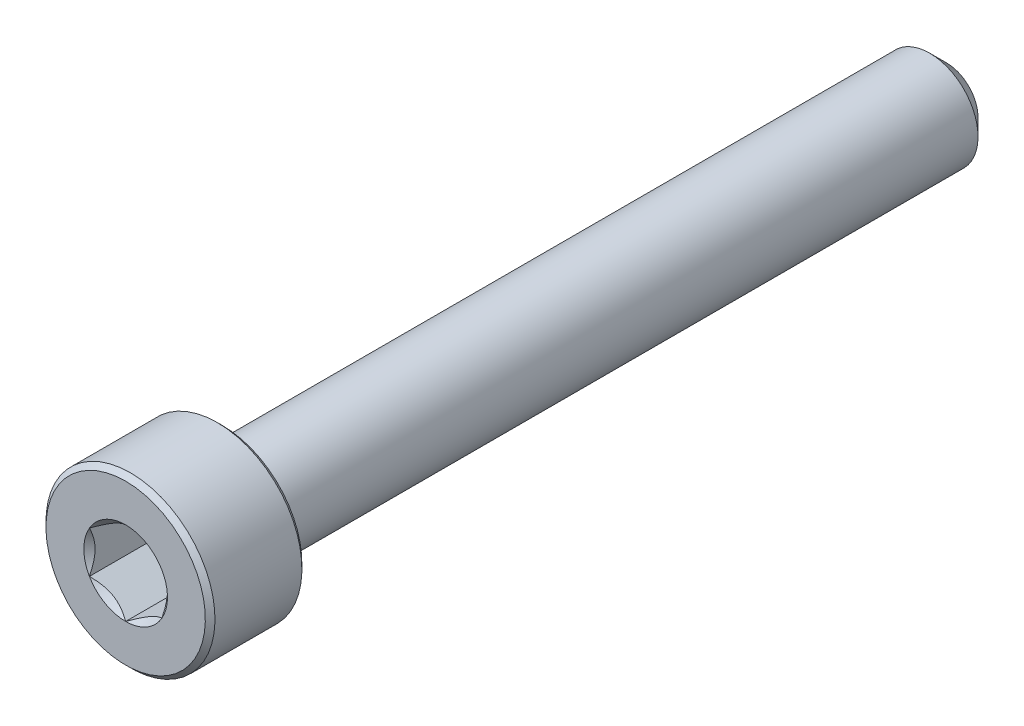
ISO-10303-21;
HEADER;
FILE_DESCRIPTION(('STEP AP214'),'2;1');
FILE_NAME('part.step','',(''),(''),'','','');
FILE_SCHEMA(('AUTOMOTIVE_DESIGN { 1 0 10303 214 1 1 1 1 }'));
ENDSEC;
DATA;
#1=APPLICATION_CONTEXT('core data for automotive mechanical design processes');
#2=APPLICATION_PROTOCOL_DEFINITION('international standard','automotive_design',2000,#1);
#3=PRODUCT_CONTEXT('',#1,'mechanical');
#4=PRODUCT('Part','Part','',(#3));
#5=PRODUCT_RELATED_PRODUCT_CATEGORY('part','',(#4));
#6=PRODUCT_DEFINITION_FORMATION('','',#4);
#7=PRODUCT_DEFINITION_CONTEXT('part definition',#1,'design');
#8=PRODUCT_DEFINITION('design','',#6,#7);
#9=PRODUCT_DEFINITION_SHAPE('','',#8);
#10=(LENGTH_UNIT() NAMED_UNIT(*) SI_UNIT(.MILLI.,.METRE.));
#11=(NAMED_UNIT(*) PLANE_ANGLE_UNIT() SI_UNIT($,.RADIAN.));
#12=(NAMED_UNIT(*) SI_UNIT($,.STERADIAN.) SOLID_ANGLE_UNIT());
#13=UNCERTAINTY_MEASURE_WITH_UNIT(LENGTH_MEASURE(1.E-05),#10,'distance_accuracy_value','');
#14=(GEOMETRIC_REPRESENTATION_CONTEXT(3) GLOBAL_UNCERTAINTY_ASSIGNED_CONTEXT((#13)) GLOBAL_UNIT_ASSIGNED_CONTEXT((#10,
#11,#12)) REPRESENTATION_CONTEXT('',''));
#15=CARTESIAN_POINT('',(0.,0.,0.));
#16=DIRECTION('',(0.,0.,1.));
#17=DIRECTION('',(1.,0.,0.));
#18=AXIS2_PLACEMENT_3D('',#15,#16,#17);
#19=CARTESIAN_POINT('',(0.,0.,17.));
#20=DIRECTION('',(0.,0.,1.));
#21=DIRECTION('',(0.,-1.,0.));
#22=AXIS2_PLACEMENT_3D('',#19,#20,#21);
#23=PLANE('',#22);
#24=CARTESIAN_POINT('',(0.,0.,17.));
#25=DIRECTION('',(0.,0.,1.));
#26=DIRECTION('',(1.,0.,0.));
#27=AXIS2_PLACEMENT_3D('',#24,#25,#26);
#28=CIRCLE('',#27,1.73205080756888);
#29=CARTESIAN_POINT('',(0.,-1.73205080756888,17.));
#30=VERTEX_POINT('',#29);
#31=CARTESIAN_POINT('',(1.5,-0.866025403784438,17.));
#32=VERTEX_POINT('',#31);
#33=EDGE_CURVE('E106',#30,#32,#28,.T.);
#34=ORIENTED_EDGE('',*,*,#33,.F.);
#35=CARTESIAN_POINT('',(-1.5,-0.866025403784439,17.));
#36=VERTEX_POINT('',#35);
#37=EDGE_CURVE('E300',#36,#30,#28,.T.);
#38=ORIENTED_EDGE('',*,*,#37,.F.);
#39=CARTESIAN_POINT('',(-1.5,0.86602540378444,17.));
#40=VERTEX_POINT('',#39);
#41=EDGE_CURVE('E147',#40,#36,#28,.T.);
#42=ORIENTED_EDGE('',*,*,#41,.F.);
#43=CARTESIAN_POINT('',(0.,1.73205080756888,17.));
#44=VERTEX_POINT('',#43);
#45=EDGE_CURVE('E140',#44,#40,#28,.T.);
#46=ORIENTED_EDGE('',*,*,#45,.F.);
#47=CARTESIAN_POINT('',(1.5,0.86602540378444,17.));
#48=VERTEX_POINT('',#47);
#49=EDGE_CURVE('E108',#48,#44,#28,.T.);
#50=ORIENTED_EDGE('',*,*,#49,.F.);
#51=EDGE_CURVE('E99',#32,#48,#28,.T.);
#52=ORIENTED_EDGE('',*,*,#51,.F.);
#53=EDGE_LOOP('',(#34,#38,#42,#46,#50,#52));
#54=FACE_BOUND('',#53,.T.);
#55=CARTESIAN_POINT('',(0.,0.,17.));
#56=DIRECTION('',(0.,0.,-1.));
#57=DIRECTION('',(0.,1.,0.));
#58=AXIS2_PLACEMENT_3D('',#55,#56,#57);
#59=CIRCLE('',#58,3.3);
#60=CARTESIAN_POINT('',(0.,3.3,17.));
#61=VERTEX_POINT('',#60);
#62=EDGE_CURVE('E55',#61,#61,#59,.T.);
#63=ORIENTED_EDGE('',*,*,#62,.F.);
#64=EDGE_LOOP('',(#63));
#65=FACE_BOUND('',#64,.T.);
#66=ADVANCED_FACE('F41',(#54,#65),#23,.T.);
#67=CARTESIAN_POINT('',(0.,0.,16.8));
#68=DIRECTION('',(0.,0.,-1.));
#69=DIRECTION('',(0.,1.,0.));
#70=AXIS2_PLACEMENT_3D('',#67,#68,#69);
#71=CONICAL_SURFACE('',#70,3.5,0.785398163397452);
#72=ORIENTED_EDGE('',*,*,#62,.T.);
#73=EDGE_LOOP('',(#72));
#74=FACE_BOUND('',#73,.T.);
#75=CARTESIAN_POINT('',(0.,0.,16.8));
#76=DIRECTION('',(0.,0.,-1.));
#77=DIRECTION('',(0.,1.,0.));
#78=AXIS2_PLACEMENT_3D('',#75,#76,#77);
#79=CIRCLE('',#78,3.5);
#80=CARTESIAN_POINT('',(0.,3.5,16.8));
#81=VERTEX_POINT('',#80);
#82=EDGE_CURVE('E233',#81,#81,#79,.T.);
#83=ORIENTED_EDGE('',*,*,#82,.F.);
#84=EDGE_LOOP('',(#83));
#85=FACE_BOUND('',#84,.T.);
#86=ADVANCED_FACE('F221',(#74,#85),#71,.T.);
#87=CARTESIAN_POINT('',(0.,0.,-17.));
#88=DIRECTION('',(0.,0.,-1.));
#89=DIRECTION('',(0.,1.,0.));
#90=AXIS2_PLACEMENT_3D('',#87,#88,#89);
#91=CYLINDRICAL_SURFACE('',#90,3.5);
#92=ORIENTED_EDGE('',*,*,#82,.T.);
#93=EDGE_LOOP('',(#92));
#94=FACE_BOUND('',#93,.T.);
#95=CARTESIAN_POINT('',(0.,0.,13.2));
#96=DIRECTION('',(0.,0.,-1.));
#97=DIRECTION('',(0.,1.,0.));
#98=AXIS2_PLACEMENT_3D('',#95,#96,#97);
#99=CIRCLE('',#98,3.5);
#100=CARTESIAN_POINT('',(0.,3.5,13.2));
#101=VERTEX_POINT('',#100);
#102=EDGE_CURVE('E235',#101,#101,#99,.T.);
#103=ORIENTED_EDGE('',*,*,#102,.F.);
#104=EDGE_LOOP('',(#103));
#105=FACE_BOUND('',#104,.T.);
#106=ADVANCED_FACE('F218',(#94,#105),#91,.T.);
#107=CARTESIAN_POINT('',(0.,0.,13.));
#108=DIRECTION('',(0.,0.,1.));
#109=DIRECTION('',(0.,-1.,0.));
#110=AXIS2_PLACEMENT_3D('',#107,#108,#109);
#111=CONICAL_SURFACE('',#110,3.3,0.785398163397443);
#112=ORIENTED_EDGE('',*,*,#102,.T.);
#113=EDGE_LOOP('',(#112));
#114=FACE_BOUND('',#113,.T.);
#115=CARTESIAN_POINT('',(0.,0.,13.));
#116=DIRECTION('',(0.,0.,-1.));
#117=DIRECTION('',(0.,1.,0.));
#118=AXIS2_PLACEMENT_3D('',#115,#116,#117);
#119=CIRCLE('',#118,3.3);
#120=CARTESIAN_POINT('',(0.,3.3,13.));
#121=VERTEX_POINT('',#120);
#122=EDGE_CURVE('E240',#121,#121,#119,.T.);
#123=ORIENTED_EDGE('',*,*,#122,.F.);
#124=EDGE_LOOP('',(#123));
#125=FACE_BOUND('',#124,.T.);
#126=ADVANCED_FACE('F214',(#114,#125),#111,.T.);
#127=CARTESIAN_POINT('',(0.,3.3,13.));
#128=DIRECTION('',(0.,0.,-1.));
#129=DIRECTION('',(0.,1.,0.));
#130=AXIS2_PLACEMENT_3D('',#127,#128,#129);
#131=PLANE('',#130);
#132=ORIENTED_EDGE('',*,*,#122,.T.);
#133=EDGE_LOOP('',(#132));
#134=FACE_BOUND('',#133,.T.);
#135=CARTESIAN_POINT('',(0.,0.,13.));
#136=DIRECTION('',(0.,0.,-1.));
#137=DIRECTION('',(0.,1.,0.));
#138=AXIS2_PLACEMENT_3D('',#135,#136,#137);
#139=CIRCLE('',#138,2.);
#140=CARTESIAN_POINT('',(0.,2.,13.));
#141=VERTEX_POINT('',#140);
#142=EDGE_CURVE('E246',#141,#141,#139,.T.);
#143=ORIENTED_EDGE('',*,*,#142,.F.);
#144=EDGE_LOOP('',(#143));
#145=FACE_BOUND('',#144,.T.);
#146=ADVANCED_FACE('F210',(#134,#145),#131,.T.);
#147=CARTESIAN_POINT('',(0.,0.,-17.));
#148=DIRECTION('',(0.,0.,-1.));
#149=DIRECTION('',(0.,1.,0.));
#150=AXIS2_PLACEMENT_3D('',#147,#148,#149);
#151=CYLINDRICAL_SURFACE('',#150,2.);
#152=ORIENTED_EDGE('',*,*,#142,.T.);
#153=EDGE_LOOP('',(#152));
#154=FACE_BOUND('',#153,.T.);
#155=CARTESIAN_POINT('',(0.,0.,-16.3));
#156=DIRECTION('',(0.,0.,-1.));
#157=DIRECTION('',(0.,1.,0.));
#158=AXIS2_PLACEMENT_3D('',#155,#156,#157);
#159=CIRCLE('',#158,2.);
#160=CARTESIAN_POINT('',(0.,2.,-16.3));
#161=VERTEX_POINT('',#160);
#162=EDGE_CURVE('E250',#161,#161,#159,.T.);
#163=ORIENTED_EDGE('',*,*,#162,.F.);
#164=EDGE_LOOP('',(#163));
#165=FACE_BOUND('',#164,.T.);
#166=ADVANCED_FACE('F206',(#154,#165),#151,.T.);
#167=CARTESIAN_POINT('',(0.,0.,-17.));
#168=DIRECTION('',(0.,0.,1.));
#169=DIRECTION('',(0.,-1.,0.));
#170=AXIS2_PLACEMENT_3D('',#167,#168,#169);
#171=CONICAL_SURFACE('',#170,1.3,0.785398163397442);
#172=ORIENTED_EDGE('',*,*,#162,.T.);
#173=EDGE_LOOP('',(#172));
#174=FACE_BOUND('',#173,.T.);
#175=CARTESIAN_POINT('',(0.,0.,-17.));
#176=DIRECTION('',(0.,0.,-1.));
#177=DIRECTION('',(0.,1.,0.));
#178=AXIS2_PLACEMENT_3D('',#175,#176,#177);
#179=CIRCLE('',#178,1.3);
#180=CARTESIAN_POINT('',(0.,1.3,-17.));
#181=VERTEX_POINT('',#180);
#182=EDGE_CURVE('E254',#181,#181,#179,.T.);
#183=ORIENTED_EDGE('',*,*,#182,.F.);
#184=EDGE_LOOP('',(#183));
#185=FACE_BOUND('',#184,.T.);
#186=ADVANCED_FACE('F202',(#174,#185),#171,.T.);
#187=CARTESIAN_POINT('',(0.,1.3,-17.));
#188=DIRECTION('',(0.,0.,-1.));
#189=DIRECTION('',(0.,1.,0.));
#190=AXIS2_PLACEMENT_3D('',#187,#188,#189);
#191=PLANE('',#190);
#192=ORIENTED_EDGE('',*,*,#182,.T.);
#193=EDGE_LOOP('',(#192));
#194=FACE_BOUND('',#193,.T.);
#195=ADVANCED_FACE('F199',(#194),#191,.T.);
#196=CARTESIAN_POINT('',(0.,0.,17.));
#197=DIRECTION('',(0.,0.,1.));
#198=DIRECTION('',(1.,0.,0.));
#199=AXIS2_PLACEMENT_3D('',#196,#197,#198);
#200=CONICAL_SURFACE('',#199,1.73205080756888,0.78539816339745);
#201=ORIENTED_EDGE('',*,*,#33,.T.);
#202=CARTESIAN_POINT('',(-0.000199999999999638,-1.73216627762272,17.0001154816001));
#203=CARTESIAN_POINT('',(0.0513677907370756,-1.70239359975915,16.9703654760673));
#204=CARTESIAN_POINT('',(0.103797917665201,-1.67212305186355,16.9423624839103));
#205=CARTESIAN_POINT('',(0.210709034055597,-1.61039789003619,16.8910892304401));
#206=CARTESIAN_POINT('',(0.265200195814662,-1.57893740312614,16.8678475050444));
#207=CARTESIAN_POINT('',(0.37507908135725,-1.51549879897987,16.8280337289922));
#208=CARTESIAN_POINT('',(0.430438809095201,-1.4835368452681,16.8113615856709));
#209=CARTESIAN_POINT('',(0.542377257477152,-1.41890915196211,16.7856744568181));
#210=CARTESIAN_POINT('',(0.59895255655301,-1.38624538781118,16.7766402904789));
#211=CARTESIAN_POINT('',(0.696455389516442,-1.32995210095299,16.7684890812269));
#212=CARTESIAN_POINT('',(0.737256908280468,-1.30639533311124,16.7672822529892));
#213=CARTESIAN_POINT('',(0.81878796961586,-1.25932335290193,16.7693140571623));
#214=CARTESIAN_POINT('',(0.859517494314631,-1.23580815085313,16.7725536707483));
#215=CARTESIAN_POINT('',(0.940584402163417,-1.18900414978427,16.783291985982));
#216=CARTESIAN_POINT('',(0.980921384598289,-1.16571558211719,16.7907946530187));
#217=CARTESIAN_POINT('',(1.06091833691403,-1.11952932016335,16.8096516119283));
#218=CARTESIAN_POINT('',(1.10057800851621,-1.09663179808786,16.8210075570186));
#219=CARTESIAN_POINT('',(1.20216313477449,-1.03798159809698,16.8547216475927));
#220=CARTESIAN_POINT('',(1.26345855370969,-1.00259267147465,16.8796218490934));
#221=CARTESIAN_POINT('',(1.35358562846331,-0.950557780604374,16.9216566532716));
#222=CARTESIAN_POINT('',(1.38328513990772,-0.933410759677147,16.9364251535591));
#223=CARTESIAN_POINT('',(1.44213790138375,-0.899432101996406,16.9673105659402));
#224=CARTESIAN_POINT('',(1.47129140422064,-0.88260031928571,16.9834268341217));
#225=CARTESIAN_POINT('',(1.5002,-0.865909933730601,17.0001154816001));
#226=B_SPLINE_CURVE_WITH_KNOTS('',3,(#202,#203,#204,#205,#206,#207,#208,#209,#210,#211,#212,
#213,#214,#215,#216,#217,#218,#219,#220,#221,#222,#223,#224,#225),.UNSPECIFIED.,.F.,.F.,(4,2,2,
2,2,2,2,2,2,2,2,4),(0.,0.199829143693305,0.40082298738239,0.598623720538183,0.795926240188891,
0.937113067959883,1.07833105577193,1.21968061668222,1.36109089931055,1.58570969637566,
1.69770705470964,1.80965120737194),.UNSPECIFIED.);
#227=EDGE_CURVE('E12',#30,#32,#226,.T.);
#228=ORIENTED_EDGE('',*,*,#227,.F.);
#229=EDGE_LOOP('',(#201,#228));
#230=FACE_BOUND('',#229,.T.);
#231=ADVANCED_FACE('F165',(#230),#200,.F.);
#232=ORIENTED_EDGE('',*,*,#37,.T.);
#233=CARTESIAN_POINT('',(-1.5002,-0.865909933730601,17.0001154816001));
#234=CARTESIAN_POINT('',(-1.44863220926292,-0.895682611594166,16.9703654760673));
#235=CARTESIAN_POINT('',(-1.3962020823348,-0.925953159489765,16.9423624839103));
#236=CARTESIAN_POINT('',(-1.2892909659444,-0.987678321317124,16.8910892304401));
#237=CARTESIAN_POINT('',(-1.23479980418534,-1.01913880822718,16.8678475050444));
#238=CARTESIAN_POINT('',(-1.12492091864275,-1.08257741237344,16.8280337289922));
#239=CARTESIAN_POINT('',(-1.0695611909048,-1.11453936608522,16.8113615856709));
#240=CARTESIAN_POINT('',(-0.957622742522848,-1.1791670593912,16.7856744568181));
#241=CARTESIAN_POINT('',(-0.90104744344699,-1.21183082354213,16.7766402904789));
#242=CARTESIAN_POINT('',(-0.803544610483557,-1.26812411040032,16.7684890812269));
#243=CARTESIAN_POINT('',(-0.762743091719532,-1.29168087824208,16.7672822529892));
#244=CARTESIAN_POINT('',(-0.681212030384139,-1.33875285845138,16.7693140571623));
#245=CARTESIAN_POINT('',(-0.640482505685368,-1.36226806050018,16.7725536707483));
#246=CARTESIAN_POINT('',(-0.559415597836582,-1.40907206156905,16.783291985982));
#247=CARTESIAN_POINT('',(-0.519078615401709,-1.43236062923612,16.7907946530187));
#248=CARTESIAN_POINT('',(-0.439081663085966,-1.47854689118997,16.8096516119283));
#249=CARTESIAN_POINT('',(-0.399421991483789,-1.50144441326546,16.8210075570186));
#250=CARTESIAN_POINT('',(-0.297836865225513,-1.56009461325633,16.8547216475927));
#251=CARTESIAN_POINT('',(-0.236541446290308,-1.59548353987866,16.8796218490934));
#252=CARTESIAN_POINT('',(-0.146414371536684,-1.64751843074894,16.9216566532716));
#253=CARTESIAN_POINT('',(-0.11671486009228,-1.66466545167617,16.9364251535591));
#254=CARTESIAN_POINT('',(-0.0578620986162473,-1.69864410935691,16.9673105659402));
#255=CARTESIAN_POINT('',(-0.0287085957793616,-1.71547589206761,16.9834268341217));
#256=CARTESIAN_POINT('',(0.000200000000000611,-1.73216627762272,17.0001154816001));
#257=B_SPLINE_CURVE_WITH_KNOTS('',3,(#233,#234,#235,#236,#237,#238,#239,#240,#241,#242,#243,
#244,#245,#246,#247,#248,#249,#250,#251,#252,#253,#254,#255,#256),.UNSPECIFIED.,.F.,.F.,(4,2,2,
2,2,2,2,2,2,2,2,4),(0.,0.199829143693305,0.40082298738239,0.598623720538183,0.795926240188892,
0.937113067959884,1.07833105577193,1.21968061668222,1.36109089931055,1.58570969637566,
1.69770705470964,1.80965120737194),.UNSPECIFIED.);
#258=EDGE_CURVE('E142',#36,#30,#257,.T.);
#259=ORIENTED_EDGE('',*,*,#258,.F.);
#260=EDGE_LOOP('',(#232,#259));
#261=FACE_BOUND('',#260,.T.);
#262=ADVANCED_FACE('F298',(#261),#200,.F.);
#263=ORIENTED_EDGE('',*,*,#41,.T.);
#264=CARTESIAN_POINT('',(-1.5,-1.72720812994822,17.5555785164605));
#265=CARTESIAN_POINT('',(-1.5,-1.68515175723693,17.5238299080399));
#266=CARTESIAN_POINT('',(-1.5,-1.64286104772391,17.4923925939825));
#267=CARTESIAN_POINT('',(-1.5,-1.55771581058238,17.430269087717));
#268=CARTESIAN_POINT('',(-1.5,-1.51486114408249,17.3995830860455));
#269=CARTESIAN_POINT('',(-1.5,-1.38468134170665,17.3084071925586));
#270=CARTESIAN_POINT('',(-1.5,-1.29637976089561,17.2492883435437));
#271=CARTESIAN_POINT('',(-1.5,-1.11121478745132,17.1332309964035));
#272=CARTESIAN_POINT('',(-1.5,-1.01415038251068,17.0766095588047));
#273=CARTESIAN_POINT('',(-1.5,-0.815173408989818,16.9730368813091));
#274=CARTESIAN_POINT('',(-1.5,-0.713278669326363,16.9260530415721));
#275=CARTESIAN_POINT('',(-1.5,-0.560333775001792,16.8685726684515));
#276=CARTESIAN_POINT('',(-1.5,-0.511547983012751,16.8520753877783));
#277=CARTESIAN_POINT('',(-1.5,-0.41279862021383,16.8229975129476));
#278=CARTESIAN_POINT('',(-1.5,-0.362834968520753,16.8104171886138));
#279=CARTESIAN_POINT('',(-1.5,-0.262863235540419,16.7900361941635));
#280=CARTESIAN_POINT('',(-1.5,-0.212872113909477,16.7821536327604));
#281=CARTESIAN_POINT('',(-1.5,-0.112355243682833,16.7713220639777));
#282=CARTESIAN_POINT('',(-1.5,-0.0618295884917323,16.7683722085294));
#283=CARTESIAN_POINT('',(-1.5,0.0374291732025481,16.7676248577218));
#284=CARTESIAN_POINT('',(-1.5,0.0861609670655328,16.7696447335505));
#285=CARTESIAN_POINT('',(-1.5,0.183206937624694,16.7783225528794));
#286=CARTESIAN_POINT('',(-1.5,0.231521073289699,16.7849809469459));
#287=CARTESIAN_POINT('',(-1.5,0.328199853268107,16.802685244089));
#288=CARTESIAN_POINT('',(-1.5,0.37655061614869,16.8138058112177));
#289=CARTESIAN_POINT('',(-1.5,0.472195696955759,16.8398434139978));
#290=CARTESIAN_POINT('',(-1.5,0.519490102919008,16.8547601319841));
#291=CARTESIAN_POINT('',(-1.5,0.668391282485062,16.9073352235115));
#292=CARTESIAN_POINT('',(-1.5,0.76787870926495,16.9509812873618));
#293=CARTESIAN_POINT('',(-1.5,0.962179866385499,17.0480229944291));
#294=CARTESIAN_POINT('',(-1.5,1.05697519927965,17.1014536648971));
#295=CARTESIAN_POINT('',(-1.5,1.23814273494588,17.2116858517578));
#296=CARTESIAN_POINT('',(-1.5,1.32469942140117,17.2681879204262));
#297=CARTESIAN_POINT('',(-1.5,1.45222331245985,17.3555343012678));
#298=CARTESIAN_POINT('',(-1.5,1.49418091932912,17.3849577583565));
#299=CARTESIAN_POINT('',(-1.5,1.5775227288333,17.4445828214816));
#300=CARTESIAN_POINT('',(-1.5,1.6189070859806,17.4747842113029));
#301=CARTESIAN_POINT('',(-1.5,1.66005277969054,17.5053081782352));
#302=B_SPLINE_CURVE_WITH_KNOTS('',3,(#264,#265,#266,#267,#268,#269,#270,#271,#272,#273,#274,
#275,#276,#277,#278,#279,#280,#281,#282,#283,#284,#285,#286,#287,#288,#289,#290,#291,#292,#293,
#294,#295,#296,#297,#298,#299,#300,#301),.UNSPECIFIED.,.F.,.F.,(4,2,2,2,2,2,2,2,2,2,2,2,2,2,2,2,
2,2,4),(0.,0.158079549012754,0.316198781054126,0.634850417468459,0.971690311551775,
1.30737131686505,1.46173961151183,1.61611853763032,1.76772101442094,1.91929742387554,
2.06538741227088,2.21149159321503,2.36014984648184,2.50879566399376,2.83376031423511,
3.15991186974582,3.4698560178094,3.62358896013691,3.77727962610764),.UNSPECIFIED.);
#303=EDGE_CURVE('E145',#40,#36,#302,.F.);
#304=ORIENTED_EDGE('',*,*,#303,.F.);
#305=EDGE_LOOP('',(#263,#304));
#306=FACE_BOUND('',#305,.T.);
#307=ADVANCED_FACE('F303',(#306),#200,.F.);
#308=ORIENTED_EDGE('',*,*,#45,.T.);
#309=CARTESIAN_POINT('',(0.00019999999999983,1.73216627762272,17.0001154816001));
#310=CARTESIAN_POINT('',(-0.0513677907370756,1.70239359975915,16.9703654760673));
#311=CARTESIAN_POINT('',(-0.103797917665201,1.67212305186355,16.9423624839103));
#312=CARTESIAN_POINT('',(-0.210709034055597,1.61039789003619,16.8910892304401));
#313=CARTESIAN_POINT('',(-0.265200195814662,1.57893740312614,16.8678475050444));
#314=CARTESIAN_POINT('',(-0.37507908135725,1.51549879897987,16.8280337289922));
#315=CARTESIAN_POINT('',(-0.430438809095202,1.4835368452681,16.8113615856709));
#316=CARTESIAN_POINT('',(-0.542377257477153,1.41890915196211,16.7856744568181));
#317=CARTESIAN_POINT('',(-0.598952556553012,1.38624538781118,16.7766402904789));
#318=CARTESIAN_POINT('',(-0.696455389516444,1.32995210095299,16.7684890812269));
#319=CARTESIAN_POINT('',(-0.73725690828047,1.30639533311124,16.7672822529892));
#320=CARTESIAN_POINT('',(-0.818787969615862,1.25932335290193,16.7693140571623));
#321=CARTESIAN_POINT('',(-0.859517494314633,1.23580815085313,16.7725536707483));
#322=CARTESIAN_POINT('',(-0.940584402163419,1.18900414978426,16.783291985982));
#323=CARTESIAN_POINT('',(-0.980921384598292,1.16571558211719,16.7907946530187));
#324=CARTESIAN_POINT('',(-1.06091833691403,1.11952932016335,16.8096516119283));
#325=CARTESIAN_POINT('',(-1.10057800851621,1.09663179808786,16.8210075570186));
#326=CARTESIAN_POINT('',(-1.20216313477449,1.03798159809698,16.8547216475927));
#327=CARTESIAN_POINT('',(-1.26345855370969,1.00259267147465,16.8796218490934));
#328=CARTESIAN_POINT('',(-1.35358562846332,0.950557780604373,16.9216566532716));
#329=CARTESIAN_POINT('',(-1.38328513990772,0.933410759677146,16.9364251535591));
#330=CARTESIAN_POINT('',(-1.44213790138375,0.899432101996406,16.9673105659402));
#331=CARTESIAN_POINT('',(-1.47129140422064,0.882600319285709,16.9834268341217));
#332=CARTESIAN_POINT('',(-1.5002,0.865909933730601,17.0001154816001));
#333=B_SPLINE_CURVE_WITH_KNOTS('',3,(#309,#310,#311,#312,#313,#314,#315,#316,#317,#318,#319,
#320,#321,#322,#323,#324,#325,#326,#327,#328,#329,#330,#331,#332),.UNSPECIFIED.,.F.,.F.,(4,2,2,
2,2,2,2,2,2,2,2,4),(0.,0.199829143693306,0.400822987382391,0.598623720538184,0.795926240188893,
0.937113067959886,1.07833105577193,1.21968061668222,1.36109089931055,1.58570969637566,
1.69770705470964,1.80965120737194),.UNSPECIFIED.);
#334=EDGE_CURVE('E119',#44,#40,#333,.T.);
#335=ORIENTED_EDGE('',*,*,#334,.F.);
#336=EDGE_LOOP('',(#308,#335));
#337=FACE_BOUND('',#336,.T.);
#338=ADVANCED_FACE('F342',(#337),#200,.F.);
#339=ORIENTED_EDGE('',*,*,#49,.T.);
#340=CARTESIAN_POINT('',(1.5002,0.865909933730601,17.0001154816001));
#341=CARTESIAN_POINT('',(1.44863220926292,0.895682611594166,16.9703654760673));
#342=CARTESIAN_POINT('',(1.3962020823348,0.925953159489765,16.9423624839103));
#343=CARTESIAN_POINT('',(1.2892909659444,0.987678321317124,16.8910892304401));
#344=CARTESIAN_POINT('',(1.23479980418534,1.01913880822718,16.8678475050444));
#345=CARTESIAN_POINT('',(1.12492091864275,1.08257741237344,16.8280337289922));
#346=CARTESIAN_POINT('',(1.0695611909048,1.11453936608521,16.8113615856709));
#347=CARTESIAN_POINT('',(0.957622742522848,1.1791670593912,16.7856744568181));
#348=CARTESIAN_POINT('',(0.90104744344699,1.21183082354213,16.7766402904789));
#349=CARTESIAN_POINT('',(0.803544610483558,1.26812411040032,16.7684890812269));
#350=CARTESIAN_POINT('',(0.762743091719533,1.29168087824208,16.7672822529892));
#351=CARTESIAN_POINT('',(0.68121203038414,1.33875285845138,16.7693140571623));
#352=CARTESIAN_POINT('',(0.640482505685369,1.36226806050018,16.7725536707483));
#353=CARTESIAN_POINT('',(0.559415597836582,1.40907206156905,16.783291985982));
#354=CARTESIAN_POINT('',(0.51907861540171,1.43236062923612,16.7907946530187));
#355=CARTESIAN_POINT('',(0.439081663085967,1.47854689118997,16.8096516119283));
#356=CARTESIAN_POINT('',(0.39942199148379,1.50144441326545,16.8210075570186));
#357=CARTESIAN_POINT('',(0.297836865225513,1.56009461325633,16.8547216475927));
#358=CARTESIAN_POINT('',(0.236541446290309,1.59548353987866,16.8796218490934));
#359=CARTESIAN_POINT('',(0.146414371536684,1.64751843074894,16.9216566532716));
#360=CARTESIAN_POINT('',(0.11671486009228,1.66466545167617,16.9364251535591));
#361=CARTESIAN_POINT('',(0.0578620986162474,1.69864410935691,16.9673105659402));
#362=CARTESIAN_POINT('',(0.0287085957793617,1.71547589206761,16.9834268341217));
#363=CARTESIAN_POINT('',(-0.000200000000000509,1.73216627762272,17.0001154816001));
#364=B_SPLINE_CURVE_WITH_KNOTS('',3,(#340,#341,#342,#343,#344,#345,#346,#347,#348,#349,#350,
#351,#352,#353,#354,#355,#356,#357,#358,#359,#360,#361,#362,#363),.UNSPECIFIED.,.F.,.F.,(4,2,2,
2,2,2,2,2,2,2,2,4),(0.,0.199829143693305,0.40082298738239,0.598623720538183,0.795926240188891,
0.937113067959883,1.07833105577193,1.21968061668222,1.36109089931055,1.58570969637566,
1.69770705470964,1.80965120737194),.UNSPECIFIED.);
#365=EDGE_CURVE('E111',#48,#44,#364,.T.);
#366=ORIENTED_EDGE('',*,*,#365,.F.);
#367=EDGE_LOOP('',(#339,#366));
#368=FACE_BOUND('',#367,.T.);
#369=ADVANCED_FACE('F112',(#368),#200,.F.);
#370=ORIENTED_EDGE('',*,*,#51,.T.);
#371=CARTESIAN_POINT('',(1.5,-1.72720812969692,17.5555785162708));
#372=CARTESIAN_POINT('',(1.5,-1.68515175699267,17.5238299078574));
#373=CARTESIAN_POINT('',(1.5,-1.64286104748673,17.4923925938074));
#374=CARTESIAN_POINT('',(1.5,-1.55771581035941,17.4302690875564));
#375=CARTESIAN_POINT('',(1.5,-1.51486114386668,17.3995830858922));
#376=CARTESIAN_POINT('',(1.5,-1.3846813415127,17.3084071924272));
#377=CARTESIAN_POINT('',(1.5,-1.29637976071653,17.2492883434268));
#378=CARTESIAN_POINT('',(1.5,-1.11121478730467,17.1332309963165));
#379=CARTESIAN_POINT('',(1.5,-1.01415038238167,17.076609558733));
#380=CARTESIAN_POINT('',(1.5,-0.815173408897604,16.9730368812657));
#381=CARTESIAN_POINT('',(1.5,-0.713278669253284,16.9260530415417));
#382=CARTESIAN_POINT('',(1.5,-0.560333774943111,16.8685726684308));
#383=CARTESIAN_POINT('',(1.5,-0.511547982948041,16.8520753877572));
#384=CARTESIAN_POINT('',(1.5,-0.412798620136866,16.822997512927));
#385=CARTESIAN_POINT('',(1.5,-0.362834968437562,16.810417188594));
#386=CARTESIAN_POINT('',(1.5,-0.262863235444981,16.7900361941468));
#387=CARTESIAN_POINT('',(1.5,-0.212872113808021,16.782153632746));
#388=CARTESIAN_POINT('',(1.5,-0.112355243569544,16.771322063969));
#389=CARTESIAN_POINT('',(1.5,-0.0618295883726257,16.7683722085244));
#390=CARTESIAN_POINT('',(1.5,0.0374291733323863,16.7676248577249));
#391=CARTESIAN_POINT('',(1.5,0.0861609672003009,16.7696447335581));
#392=CARTESIAN_POINT('',(1.5,0.183206937768828,16.7783225528968));
#393=CARTESIAN_POINT('',(1.5,0.23152107343827,16.7849809469685));
#394=CARTESIAN_POINT('',(1.5,0.328199853425437,16.8026852441226));
#395=CARTESIAN_POINT('',(1.5,0.376550616310329,16.813805811257));
#396=CARTESIAN_POINT('',(1.5,0.472195697125599,16.8398434140487));
#397=CARTESIAN_POINT('',(1.5,0.519490103092741,16.8547601320409));
#398=CARTESIAN_POINT('',(1.5,0.668391282696624,16.9073352235961));
#399=CARTESIAN_POINT('',(1.5,0.767878709508552,16.950981287472));
#400=CARTESIAN_POINT('',(1.5,0.962179866690723,17.0480229945931));
#401=CARTESIAN_POINT('',(1.5,1.05697519961444,17.1014536650895));
#402=CARTESIAN_POINT('',(1.5,1.23814273533383,17.2116858520046));
#403=CARTESIAN_POINT('',(1.5,1.3246994218129,17.2681879206986));
#404=CARTESIAN_POINT('',(1.5,1.45222331290673,17.3555343015787));
#405=CARTESIAN_POINT('',(1.5,1.49418091978756,17.38495775868));
#406=CARTESIAN_POINT('',(1.5,1.57752272931476,17.4445828218305));
#407=CARTESIAN_POINT('',(1.5,1.61890708647354,17.4747842116644));
#408=CARTESIAN_POINT('',(1.5,1.66005278019494,17.5053081786095));
#409=B_SPLINE_CURVE_WITH_KNOTS('',3,(#371,#372,#373,#374,#375,#376,#377,#378,#379,#380,#381,
#382,#383,#384,#385,#386,#387,#388,#389,#390,#391,#392,#393,#394,#395,#396,#397,#398,#399,#400,
#401,#402,#403,#404,#405,#406,#407,#408),.UNSPECIFIED.,.F.,.F.,(4,2,2,2,2,2,2,2,2,2,2,2,2,2,2,2,
2,2,4),(0.,0.15807954898267,0.316198780993941,0.634850417346955,0.971690311361506,
1.30737131660666,1.46173961127088,1.61611853740677,1.76772101421409,1.91929742368538,
2.065387412096,2.21149159305544,2.36014984633872,2.50879566386709,2.83376031422673,
3.15991186985651,3.46985601802197,3.62358896039973,3.7772796264207),.UNSPECIFIED.);
#410=EDGE_CURVE('E61',#32,#48,#409,.T.);
#411=ORIENTED_EDGE('',*,*,#410,.F.);
#412=EDGE_LOOP('',(#370,#411));
#413=FACE_BOUND('',#412,.T.);
#414=ADVANCED_FACE('F101',(#413),#200,.F.);
#415=CARTESIAN_POINT('',(0.,3.3,14.));
#416=DIRECTION('',(0.,0.,-1.));
#417=DIRECTION('',(0.,1.,0.));
#418=AXIS2_PLACEMENT_3D('',#415,#416,#417);
#419=PLANE('',#418);
#420=DIRECTION('',(0.866025403784438,0.5,0.));
#421=VECTOR('',#420,1.);
#422=CARTESIAN_POINT('',(0.,-1.73205080756888,14.));
#423=LINE('',#422,#421);
#424=CARTESIAN_POINT('',(0.,-1.73205080756888,14.));
#425=VERTEX_POINT('',#424);
#426=CARTESIAN_POINT('',(1.5,-0.866025403784438,14.));
#427=VERTEX_POINT('',#426);
#428=EDGE_CURVE('E259',#425,#427,#423,.T.);
#429=ORIENTED_EDGE('',*,*,#428,.T.);
#430=DIRECTION('',(0.,1.,0.));
#431=VECTOR('',#430,1.);
#432=CARTESIAN_POINT('',(1.5,-0.866025403784438,14.));
#433=LINE('',#432,#431);
#434=CARTESIAN_POINT('',(1.5,0.866025403784439,14.));
#435=VERTEX_POINT('',#434);
#436=EDGE_CURVE('E130',#427,#435,#433,.T.);
#437=ORIENTED_EDGE('',*,*,#436,.T.);
#438=DIRECTION('',(-0.866025403784439,0.5,0.));
#439=VECTOR('',#438,1.);
#440=CARTESIAN_POINT('',(1.5,0.866025403784439,14.));
#441=LINE('',#440,#439);
#442=CARTESIAN_POINT('',(0.,1.73205080756888,14.));
#443=VERTEX_POINT('',#442);
#444=EDGE_CURVE('E134',#435,#443,#441,.T.);
#445=ORIENTED_EDGE('',*,*,#444,.T.);
#446=DIRECTION('',(-0.866025403784438,-0.5,0.));
#447=VECTOR('',#446,1.);
#448=CARTESIAN_POINT('',(0.,1.73205080756888,14.));
#449=LINE('',#448,#447);
#450=CARTESIAN_POINT('',(-1.5,0.866025403784439,14.));
#451=VERTEX_POINT('',#450);
#452=EDGE_CURVE('E264',#443,#451,#449,.T.);
#453=ORIENTED_EDGE('',*,*,#452,.T.);
#454=DIRECTION('',(0.,-1.,0.));
#455=VECTOR('',#454,1.);
#456=CARTESIAN_POINT('',(-1.5,0.866025403784438,14.));
#457=LINE('',#456,#455);
#458=CARTESIAN_POINT('',(-1.5,-0.866025403784439,14.));
#459=VERTEX_POINT('',#458);
#460=EDGE_CURVE('E269',#451,#459,#457,.T.);
#461=ORIENTED_EDGE('',*,*,#460,.T.);
#462=DIRECTION('',(0.866025403784439,-0.5,0.));
#463=VECTOR('',#462,1.);
#464=CARTESIAN_POINT('',(-1.5,-0.866025403784439,14.));
#465=LINE('',#464,#463);
#466=EDGE_CURVE('E272',#459,#425,#465,.T.);
#467=ORIENTED_EDGE('',*,*,#466,.T.);
#468=EDGE_LOOP('',(#429,#437,#445,#453,#461,#467));
#469=FACE_BOUND('',#468,.T.);
#470=ADVANCED_FACE('F164',(#469),#419,.F.);
#471=CARTESIAN_POINT('',(0.,-1.73205080756888,8.41742430504416));
#472=DIRECTION('',(0.5,-0.866025403784438,0.));
#473=DIRECTION('',(0.866025403784438,0.5,0.));
#474=AXIS2_PLACEMENT_3D('',#471,#472,#473);
#475=PLANE('',#474);
#476=DIRECTION('',(0.,0.,1.));
#477=VECTOR('',#476,1.);
#478=CARTESIAN_POINT('',(0.,-1.73205080756888,8.41742430504416));
#479=LINE('',#478,#477);
#480=EDGE_CURVE('E273',#425,#30,#479,.T.);
#481=ORIENTED_EDGE('',*,*,#480,.T.);
#482=ORIENTED_EDGE('',*,*,#227,.T.);
#483=DIRECTION('',(0.,0.,1.));
#484=VECTOR('',#483,1.);
#485=CARTESIAN_POINT('',(1.5,-0.866025403784438,8.41742430504416));
#486=LINE('',#485,#484);
#487=EDGE_CURVE('E128',#427,#32,#486,.T.);
#488=ORIENTED_EDGE('',*,*,#487,.F.);
#489=ORIENTED_EDGE('',*,*,#428,.F.);
#490=EDGE_LOOP('',(#481,#482,#488,#489));
#491=FACE_BOUND('',#490,.T.);
#492=ADVANCED_FACE('F166',(#491),#475,.F.);
#493=CARTESIAN_POINT('',(-1.5,-0.866025403784439,8.41742430504416));
#494=DIRECTION('',(-0.5,-0.866025403784439,0.));
#495=DIRECTION('',(0.866025403784439,-0.5,0.));
#496=AXIS2_PLACEMENT_3D('',#493,#494,#495);
#497=PLANE('',#496);
#498=DIRECTION('',(0.,0.,1.));
#499=VECTOR('',#498,1.);
#500=CARTESIAN_POINT('',(-1.5,-0.866025403784439,8.41742430504416));
#501=LINE('',#500,#499);
#502=EDGE_CURVE('E69',#459,#36,#501,.T.);
#503=ORIENTED_EDGE('',*,*,#502,.T.);
#504=ORIENTED_EDGE('',*,*,#258,.T.);
#505=ORIENTED_EDGE('',*,*,#480,.F.);
#506=ORIENTED_EDGE('',*,*,#466,.F.);
#507=EDGE_LOOP('',(#503,#504,#505,#506));
#508=FACE_BOUND('',#507,.T.);
#509=ADVANCED_FACE('F160',(#508),#497,.F.);
#510=CARTESIAN_POINT('',(-1.5,0.866025403784438,8.41742430504416));
#511=DIRECTION('',(-1.,0.,0.));
#512=DIRECTION('',(0.,-1.,0.));
#513=AXIS2_PLACEMENT_3D('',#510,#511,#512);
#514=PLANE('',#513);
#515=DIRECTION('',(0.,0.,1.));
#516=VECTOR('',#515,1.);
#517=CARTESIAN_POINT('',(-1.5,0.866025403784438,8.41742430504416));
#518=LINE('',#517,#516);
#519=EDGE_CURVE('E265',#451,#40,#518,.T.);
#520=ORIENTED_EDGE('',*,*,#519,.T.);
#521=ORIENTED_EDGE('',*,*,#303,.T.);
#522=ORIENTED_EDGE('',*,*,#502,.F.);
#523=ORIENTED_EDGE('',*,*,#460,.F.);
#524=EDGE_LOOP('',(#520,#521,#522,#523));
#525=FACE_BOUND('',#524,.T.);
#526=ADVANCED_FACE('F314',(#525),#514,.F.);
#527=CARTESIAN_POINT('',(0.,1.73205080756888,8.41742430504416));
#528=DIRECTION('',(-0.5,0.866025403784438,0.));
#529=DIRECTION('',(-0.866025403784438,-0.5,0.));
#530=AXIS2_PLACEMENT_3D('',#527,#528,#529);
#531=PLANE('',#530);
#532=DIRECTION('',(0.,0.,1.));
#533=VECTOR('',#532,1.);
#534=CARTESIAN_POINT('',(0.,1.73205080756888,8.41742430504416));
#535=LINE('',#534,#533);
#536=EDGE_CURVE('E261',#443,#44,#535,.T.);
#537=ORIENTED_EDGE('',*,*,#536,.T.);
#538=ORIENTED_EDGE('',*,*,#334,.T.);
#539=ORIENTED_EDGE('',*,*,#519,.F.);
#540=ORIENTED_EDGE('',*,*,#452,.F.);
#541=EDGE_LOOP('',(#537,#538,#539,#540));
#542=FACE_BOUND('',#541,.T.);
#543=ADVANCED_FACE('F191',(#542),#531,.F.);
#544=CARTESIAN_POINT('',(1.5,0.866025403784439,8.41742430504416));
#545=DIRECTION('',(0.5,0.866025403784439,0.));
#546=DIRECTION('',(-0.866025403784439,0.5,0.));
#547=AXIS2_PLACEMENT_3D('',#544,#545,#546);
#548=PLANE('',#547);
#549=DIRECTION('',(0.,0.,1.));
#550=VECTOR('',#549,1.);
#551=CARTESIAN_POINT('',(1.5,0.866025403784439,8.41742430504416));
#552=LINE('',#551,#550);
#553=EDGE_CURVE('E125',#435,#48,#552,.T.);
#554=ORIENTED_EDGE('',*,*,#553,.T.);
#555=ORIENTED_EDGE('',*,*,#365,.T.);
#556=ORIENTED_EDGE('',*,*,#536,.F.);
#557=ORIENTED_EDGE('',*,*,#444,.F.);
#558=EDGE_LOOP('',(#554,#555,#556,#557));
#559=FACE_BOUND('',#558,.T.);
#560=ADVANCED_FACE('F132',(#559),#548,.F.);
#561=CARTESIAN_POINT('',(1.5,-0.866025403784438,8.41742430504416));
#562=DIRECTION('',(1.,0.,0.));
#563=DIRECTION('',(0.,0.,-1.));
#564=AXIS2_PLACEMENT_3D('',#561,#562,#563);
#565=PLANE('',#564);
#566=ORIENTED_EDGE('',*,*,#487,.T.);
#567=ORIENTED_EDGE('',*,*,#410,.T.);
#568=ORIENTED_EDGE('',*,*,#553,.F.);
#569=ORIENTED_EDGE('',*,*,#436,.F.);
#570=EDGE_LOOP('',(#566,#567,#568,#569));
#571=FACE_BOUND('',#570,.T.);
#572=ADVANCED_FACE('F124',(#571),#565,.F.);
#573=CLOSED_SHELL('',(#66,#86,#106,#126,#146,#166,#186,#195,#231,#262,#307,#338,#369,#414,#470,
#492,#509,#526,#543,#560,#572));
#574=MANIFOLD_SOLID_BREP('B2',#573);
#575=ADVANCED_BREP_SHAPE_REPRESENTATION('',(#18,#574),#14);
#576=SHAPE_DEFINITION_REPRESENTATION(#9,#575);
ENDSEC;
END-ISO-10303-21;
